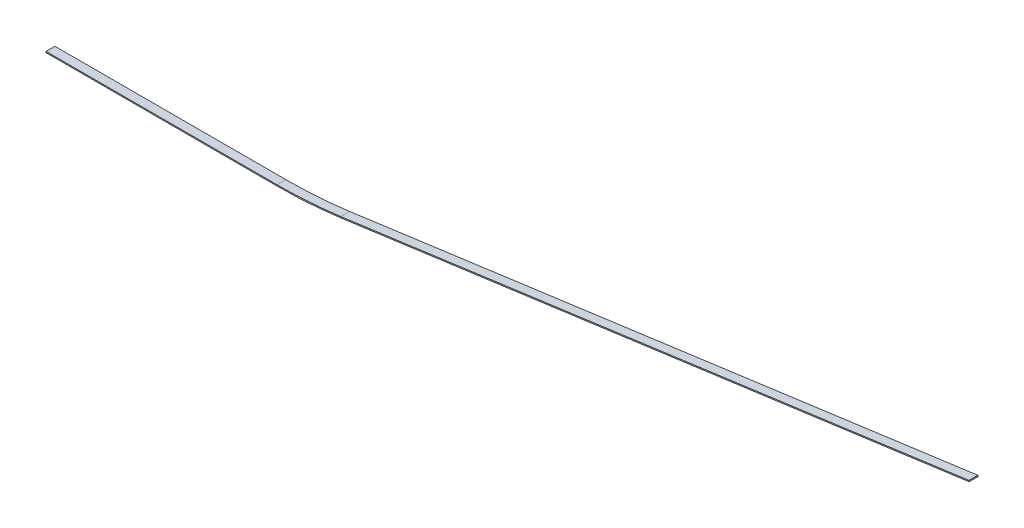
ISO-10303-21;
HEADER;
FILE_DESCRIPTION(('STEP AP214'),'2;1');
FILE_NAME('part.step','',(''),(''),'','','');
FILE_SCHEMA(('AUTOMOTIVE_DESIGN { 1 0 10303 214 1 1 1 1 }'));
ENDSEC;
DATA;
#1=APPLICATION_CONTEXT('core data for automotive mechanical design processes');
#2=APPLICATION_PROTOCOL_DEFINITION('international standard','automotive_design',2000,#1);
#3=PRODUCT_CONTEXT('',#1,'mechanical');
#4=PRODUCT('Part','Part','',(#3));
#5=PRODUCT_RELATED_PRODUCT_CATEGORY('part','',(#4));
#6=PRODUCT_DEFINITION_FORMATION('','',#4);
#7=PRODUCT_DEFINITION_CONTEXT('part definition',#1,'design');
#8=PRODUCT_DEFINITION('design','',#6,#7);
#9=PRODUCT_DEFINITION_SHAPE('','',#8);
#10=(LENGTH_UNIT() NAMED_UNIT(*) SI_UNIT(.MILLI.,.METRE.));
#11=(NAMED_UNIT(*) PLANE_ANGLE_UNIT() SI_UNIT($,.RADIAN.));
#12=(NAMED_UNIT(*) SI_UNIT($,.STERADIAN.) SOLID_ANGLE_UNIT());
#13=UNCERTAINTY_MEASURE_WITH_UNIT(LENGTH_MEASURE(1.E-05),#10,'distance_accuracy_value','');
#14=(GEOMETRIC_REPRESENTATION_CONTEXT(3) GLOBAL_UNCERTAINTY_ASSIGNED_CONTEXT((#13)) GLOBAL_UNIT_ASSIGNED_CONTEXT((#10,
#11,#12)) REPRESENTATION_CONTEXT('',''));
#15=CARTESIAN_POINT('',(0.,0.,0.));
#16=DIRECTION('',(0.,0.,1.));
#17=DIRECTION('',(1.,0.,0.));
#18=AXIS2_PLACEMENT_3D('',#15,#16,#17);
#19=CARTESIAN_POINT('',(5501.69221697348,3000.89216609369,9.525));
#20=DIRECTION('',(0.,1.,0.));
#21=DIRECTION('',(0.,0.,1.));
#22=AXIS2_PLACEMENT_3D('',#19,#20,#21);
#23=PLANE('',#22);
#24=DIRECTION('',(1.,0.,0.));
#25=VECTOR('',#24,1.);
#26=CARTESIAN_POINT('',(5501.69221697348,3000.89216609369,0.));
#27=LINE('',#26,#25);
#28=CARTESIAN_POINT('',(5501.69221697348,3000.89216609369,0.));
#29=VERTEX_POINT('',#28);
#30=CARTESIAN_POINT('',(5749.80284751638,3000.89216609369,0.));
#31=VERTEX_POINT('',#30);
#32=EDGE_CURVE('E131',#29,#31,#27,.T.);
#33=ORIENTED_EDGE('',*,*,#32,.T.);
#34=DIRECTION('',(0.,0.,-1.));
#35=VECTOR('',#34,1.);
#36=CARTESIAN_POINT('',(5749.80284751638,3000.89216609369,9.525));
#37=LINE('',#36,#35);
#38=CARTESIAN_POINT('',(5749.80284751638,3000.89216609369,9.525));
#39=VERTEX_POINT('',#38);
#40=EDGE_CURVE('E11',#39,#31,#37,.T.);
#41=ORIENTED_EDGE('',*,*,#40,.F.);
#42=DIRECTION('',(1.,0.,0.));
#43=VECTOR('',#42,1.);
#44=CARTESIAN_POINT('',(5501.69221697348,3000.89216609369,9.525));
#45=LINE('',#44,#43);
#46=CARTESIAN_POINT('',(5501.69221697348,3000.89216609369,9.525));
#47=VERTEX_POINT('',#46);
#48=EDGE_CURVE('E145',#47,#39,#45,.T.);
#49=ORIENTED_EDGE('',*,*,#48,.F.);
#50=DIRECTION('',(0.,0.,-1.));
#51=VECTOR('',#50,1.);
#52=CARTESIAN_POINT('',(5501.69221697348,3000.89216609369,9.525));
#53=LINE('',#52,#51);
#54=EDGE_CURVE('E127',#47,#29,#53,.T.);
#55=ORIENTED_EDGE('',*,*,#54,.T.);
#56=EDGE_LOOP('',(#33,#41,#49,#55));
#57=FACE_BOUND('',#56,.T.);
#58=ADVANCED_FACE('F35',(#57),#23,.F.);
#59=CARTESIAN_POINT('',(5749.80284751639,3508.89216609369,9.525));
#60=DIRECTION('',(0.,0.,-1.));
#61=DIRECTION('',(-1.,0.,0.));
#62=AXIS2_PLACEMENT_3D('',#59,#60,#61);
#63=CYLINDRICAL_SURFACE('',#62,508.);
#64=CARTESIAN_POINT('',(5749.80284751639,3508.89216609369,0.));
#65=DIRECTION('',(0.,0.,1.));
#66=DIRECTION('',(1.,0.,0.));
#67=AXIS2_PLACEMENT_3D('',#64,#65,#66);
#68=CIRCLE('',#67,508.);
#69=CARTESIAN_POINT('',(5818.41578125789,3005.54709030236,0.));
#70=VERTEX_POINT('',#69);
#71=EDGE_CURVE('E134',#31,#70,#68,.T.);
#72=ORIENTED_EDGE('',*,*,#71,.T.);
#73=DIRECTION('',(0.,0.,-1.));
#74=VECTOR('',#73,1.);
#75=CARTESIAN_POINT('',(5818.41578125789,3005.54709030236,9.525));
#76=LINE('',#75,#74);
#77=CARTESIAN_POINT('',(5818.41578125789,3005.54709030236,9.525));
#78=VERTEX_POINT('',#77);
#79=EDGE_CURVE('E43',#78,#70,#76,.T.);
#80=ORIENTED_EDGE('',*,*,#79,.F.);
#81=CARTESIAN_POINT('',(5749.80284751639,3508.89216609369,9.525));
#82=DIRECTION('',(0.,0.,1.));
#83=DIRECTION('',(1.,0.,0.));
#84=AXIS2_PLACEMENT_3D('',#81,#82,#83);
#85=CIRCLE('',#84,508.);
#86=EDGE_CURVE('E94',#39,#78,#85,.T.);
#87=ORIENTED_EDGE('',*,*,#86,.F.);
#88=ORIENTED_EDGE('',*,*,#40,.T.);
#89=EDGE_LOOP('',(#72,#80,#87,#88));
#90=FACE_BOUND('',#89,.T.);
#91=ADVANCED_FACE('F180',(#90),#63,.T.);
#92=CARTESIAN_POINT('',(5818.41578125789,3005.54709030236,9.525));
#93=DIRECTION('',(-0.135064830199822,0.990836763368767,0.));
#94=DIRECTION('',(-0.990836763368767,-0.135064830199822,0.));
#95=AXIS2_PLACEMENT_3D('',#92,#93,#94);
#96=PLANE('',#95);
#97=DIRECTION('',(0.990836763368767,0.135064830199822,0.));
#98=VECTOR('',#97,1.);
#99=CARTESIAN_POINT('',(5818.41578125789,3005.54709030236,0.));
#100=LINE('',#99,#98);
#101=CARTESIAN_POINT('',(6493.31572066677,3097.54533773134,0.));
#102=VERTEX_POINT('',#101);
#103=EDGE_CURVE('E136',#70,#102,#100,.T.);
#104=ORIENTED_EDGE('',*,*,#103,.T.);
#105=DIRECTION('',(0.,0.,-1.));
#106=VECTOR('',#105,1.);
#107=CARTESIAN_POINT('',(6493.31572066677,3097.54533773134,9.525));
#108=LINE('',#107,#106);
#109=CARTESIAN_POINT('',(6493.31572066677,3097.54533773134,9.525));
#110=VERTEX_POINT('',#109);
#111=EDGE_CURVE('E152',#110,#102,#108,.T.);
#112=ORIENTED_EDGE('',*,*,#111,.F.);
#113=DIRECTION('',(0.990836763368767,0.135064830199822,0.));
#114=VECTOR('',#113,1.);
#115=CARTESIAN_POINT('',(5818.41578125789,3005.54709030236,9.525));
#116=LINE('',#115,#114);
#117=EDGE_CURVE('E160',#78,#110,#116,.T.);
#118=ORIENTED_EDGE('',*,*,#117,.F.);
#119=ORIENTED_EDGE('',*,*,#79,.T.);
#120=EDGE_LOOP('',(#104,#112,#118,#119));
#121=FACE_BOUND('',#120,.T.);
#122=ADVANCED_FACE('F158',(#121),#96,.F.);
#123=CARTESIAN_POINT('',(6493.31572066677,3097.54533773134,9.525));
#124=DIRECTION('',(-0.990268068741507,-0.139173100960516,0.));
#125=DIRECTION('',(0.139173100960516,-0.990268068741507,0.));
#126=AXIS2_PLACEMENT_3D('',#123,#124,#125);
#127=PLANE('',#126);
#128=DIRECTION('',(-0.139173100960516,0.990268068741507,0.));
#129=VECTOR('',#128,1.);
#130=CARTESIAN_POINT('',(6493.31572066677,3097.54533773134,0.));
#131=LINE('',#130,#129);
#132=CARTESIAN_POINT('',(6493.14603936271,3098.75268294471,0.));
#133=VERTEX_POINT('',#132);
#134=EDGE_CURVE('E138',#102,#133,#131,.T.);
#135=ORIENTED_EDGE('',*,*,#134,.T.);
#136=DIRECTION('',(0.,0.,-1.));
#137=VECTOR('',#136,1.);
#138=CARTESIAN_POINT('',(6493.14603936271,3098.75268294471,9.525));
#139=LINE('',#138,#137);
#140=CARTESIAN_POINT('',(6493.14603936271,3098.75268294471,9.525));
#141=VERTEX_POINT('',#140);
#142=EDGE_CURVE('E149',#141,#133,#139,.T.);
#143=ORIENTED_EDGE('',*,*,#142,.F.);
#144=DIRECTION('',(-0.139173100960516,0.990268068741507,0.));
#145=VECTOR('',#144,1.);
#146=CARTESIAN_POINT('',(6493.31572066677,3097.54533773134,9.525));
#147=LINE('',#146,#145);
#148=EDGE_CURVE('E172',#110,#141,#147,.T.);
#149=ORIENTED_EDGE('',*,*,#148,.F.);
#150=ORIENTED_EDGE('',*,*,#111,.T.);
#151=EDGE_LOOP('',(#135,#143,#149,#150));
#152=FACE_BOUND('',#151,.T.);
#153=ADVANCED_FACE('F168',(#152),#127,.F.);
#154=CARTESIAN_POINT('',(5818.25111021691,3006.75511848426,9.525));
#155=DIRECTION('',(0.135064830199822,-0.990836763368766,0.));
#156=DIRECTION('',(0.990836763368767,0.135064830199822,0.));
#157=AXIS2_PLACEMENT_3D('',#154,#155,#156);
#158=PLANE('',#157);
#159=DIRECTION('',(-0.990836763368767,-0.135064830199822,0.));
#160=VECTOR('',#159,1.);
#161=CARTESIAN_POINT('',(5818.25111021691,3006.75511848426,0.));
#162=LINE('',#161,#160);
#163=CARTESIAN_POINT('',(5818.25111021691,3006.75511848426,0.));
#164=VERTEX_POINT('',#163);
#165=EDGE_CURVE('E140',#133,#164,#162,.T.);
#166=ORIENTED_EDGE('',*,*,#165,.T.);
#167=DIRECTION('',(0.,0.,-1.));
#168=VECTOR('',#167,1.);
#169=CARTESIAN_POINT('',(5818.25111021691,3006.75511848426,9.525));
#170=LINE('',#169,#168);
#171=CARTESIAN_POINT('',(5818.25111021691,3006.75511848426,9.525));
#172=VERTEX_POINT('',#171);
#173=EDGE_CURVE('E122',#172,#164,#170,.T.);
#174=ORIENTED_EDGE('',*,*,#173,.F.);
#175=DIRECTION('',(-0.990836763368767,-0.135064830199822,0.));
#176=VECTOR('',#175,1.);
#177=CARTESIAN_POINT('',(5818.25111021691,3006.75511848426,9.525));
#178=LINE('',#177,#176);
#179=EDGE_CURVE('E113',#141,#172,#178,.T.);
#180=ORIENTED_EDGE('',*,*,#179,.F.);
#181=ORIENTED_EDGE('',*,*,#142,.T.);
#182=EDGE_LOOP('',(#166,#174,#180,#181));
#183=FACE_BOUND('',#182,.T.);
#184=ADVANCED_FACE('F171',(#183),#158,.F.);
#185=CARTESIAN_POINT('',(5749.80284751639,3508.89216609369,9.525));
#186=DIRECTION('',(0.,0.,-1.));
#187=DIRECTION('',(-1.,0.,0.));
#188=AXIS2_PLACEMENT_3D('',#185,#186,#187);
#189=CYLINDRICAL_SURFACE('',#188,506.780799999999);
#190=CARTESIAN_POINT('',(5749.80284751639,3508.89216609369,0.));
#191=DIRECTION('',(0.,0.,-1.));
#192=DIRECTION('',(1.,0.,0.));
#193=AXIS2_PLACEMENT_3D('',#190,#191,#192);
#194=CIRCLE('',#193,506.780799999999);
#195=CARTESIAN_POINT('',(5749.80284751638,3002.11136609369,0.));
#196=VERTEX_POINT('',#195);
#197=EDGE_CURVE('E121',#164,#196,#194,.T.);
#198=ORIENTED_EDGE('',*,*,#197,.T.);
#199=DIRECTION('',(0.,0.,-1.));
#200=VECTOR('',#199,1.);
#201=CARTESIAN_POINT('',(5749.80284751638,3002.11136609369,9.525));
#202=LINE('',#201,#200);
#203=CARTESIAN_POINT('',(5749.80284751638,3002.11136609369,9.525));
#204=VERTEX_POINT('',#203);
#205=EDGE_CURVE('E118',#204,#196,#202,.T.);
#206=ORIENTED_EDGE('',*,*,#205,.F.);
#207=CARTESIAN_POINT('',(5749.80284751639,3508.89216609369,9.525));
#208=DIRECTION('',(0.,0.,-1.));
#209=DIRECTION('',(1.,0.,0.));
#210=AXIS2_PLACEMENT_3D('',#207,#208,#209);
#211=CIRCLE('',#210,506.780799999999);
#212=EDGE_CURVE('E107',#172,#204,#211,.T.);
#213=ORIENTED_EDGE('',*,*,#212,.F.);
#214=ORIENTED_EDGE('',*,*,#173,.T.);
#215=EDGE_LOOP('',(#198,#206,#213,#214));
#216=FACE_BOUND('',#215,.T.);
#217=ADVANCED_FACE('F119',(#216),#189,.F.);
#218=CARTESIAN_POINT('',(5501.69221697348,3002.11136609369,9.525));
#219=DIRECTION('',(0.,-1.,0.));
#220=DIRECTION('',(1.,0.,0.));
#221=AXIS2_PLACEMENT_3D('',#218,#219,#220);
#222=PLANE('',#221);
#223=DIRECTION('',(-1.,0.,0.));
#224=VECTOR('',#223,1.);
#225=CARTESIAN_POINT('',(5501.69221697348,3002.11136609369,0.));
#226=LINE('',#225,#224);
#227=CARTESIAN_POINT('',(5501.69221697348,3002.11136609369,0.));
#228=VERTEX_POINT('',#227);
#229=EDGE_CURVE('E80',#196,#228,#226,.T.);
#230=ORIENTED_EDGE('',*,*,#229,.T.);
#231=DIRECTION('',(0.,0.,-1.));
#232=VECTOR('',#231,1.);
#233=CARTESIAN_POINT('',(5501.69221697348,3002.11136609369,9.525));
#234=LINE('',#233,#232);
#235=CARTESIAN_POINT('',(5501.69221697348,3002.11136609369,9.525));
#236=VERTEX_POINT('',#235);
#237=EDGE_CURVE('E123',#236,#228,#234,.T.);
#238=ORIENTED_EDGE('',*,*,#237,.F.);
#239=DIRECTION('',(-1.,0.,0.));
#240=VECTOR('',#239,1.);
#241=CARTESIAN_POINT('',(5501.69221697348,3002.11136609369,9.525));
#242=LINE('',#241,#240);
#243=EDGE_CURVE('E111',#204,#236,#242,.T.);
#244=ORIENTED_EDGE('',*,*,#243,.F.);
#245=ORIENTED_EDGE('',*,*,#205,.T.);
#246=EDGE_LOOP('',(#230,#238,#244,#245));
#247=FACE_BOUND('',#246,.T.);
#248=ADVANCED_FACE('F125',(#247),#222,.F.);
#249=CARTESIAN_POINT('',(5501.69221697348,3000.89216609369,9.525));
#250=DIRECTION('',(1.,0.,0.));
#251=DIRECTION('',(0.,0.,-1.));
#252=AXIS2_PLACEMENT_3D('',#249,#250,#251);
#253=PLANE('',#252);
#254=DIRECTION('',(0.,-1.,0.));
#255=VECTOR('',#254,1.);
#256=CARTESIAN_POINT('',(5501.69221697348,3000.89216609369,0.));
#257=LINE('',#256,#255);
#258=EDGE_CURVE('E86',#228,#29,#257,.T.);
#259=ORIENTED_EDGE('',*,*,#258,.T.);
#260=ORIENTED_EDGE('',*,*,#54,.F.);
#261=DIRECTION('',(0.,-1.,0.));
#262=VECTOR('',#261,1.);
#263=CARTESIAN_POINT('',(5501.69221697348,3000.89216609369,9.525));
#264=LINE('',#263,#262);
#265=EDGE_CURVE('E51',#236,#47,#264,.T.);
#266=ORIENTED_EDGE('',*,*,#265,.F.);
#267=ORIENTED_EDGE('',*,*,#237,.T.);
#268=EDGE_LOOP('',(#259,#260,#266,#267));
#269=FACE_BOUND('',#268,.T.);
#270=ADVANCED_FACE('F196',(#269),#253,.F.);
#271=CARTESIAN_POINT('',(5749.80284751639,3508.89216609369,9.525));
#272=DIRECTION('',(0.,0.,1.));
#273=DIRECTION('',(1.,0.,0.));
#274=AXIS2_PLACEMENT_3D('',#271,#272,#273);
#275=PLANE('',#274);
#276=ORIENTED_EDGE('',*,*,#48,.T.);
#277=ORIENTED_EDGE('',*,*,#86,.T.);
#278=ORIENTED_EDGE('',*,*,#117,.T.);
#279=ORIENTED_EDGE('',*,*,#148,.T.);
#280=ORIENTED_EDGE('',*,*,#179,.T.);
#281=ORIENTED_EDGE('',*,*,#212,.T.);
#282=ORIENTED_EDGE('',*,*,#243,.T.);
#283=ORIENTED_EDGE('',*,*,#265,.T.);
#284=EDGE_LOOP('',(#276,#277,#278,#279,#280,#281,#282,#283));
#285=FACE_BOUND('',#284,.T.);
#286=ADVANCED_FACE('F109',(#285),#275,.T.);
#287=CARTESIAN_POINT('',(5749.80284751639,3508.89216609369,0.));
#288=DIRECTION('',(0.,0.,1.));
#289=DIRECTION('',(1.,0.,0.));
#290=AXIS2_PLACEMENT_3D('',#287,#288,#289);
#291=PLANE('',#290);
#292=ORIENTED_EDGE('',*,*,#32,.F.);
#293=ORIENTED_EDGE('',*,*,#258,.F.);
#294=ORIENTED_EDGE('',*,*,#229,.F.);
#295=ORIENTED_EDGE('',*,*,#197,.F.);
#296=ORIENTED_EDGE('',*,*,#165,.F.);
#297=ORIENTED_EDGE('',*,*,#134,.F.);
#298=ORIENTED_EDGE('',*,*,#103,.F.);
#299=ORIENTED_EDGE('',*,*,#71,.F.);
#300=EDGE_LOOP('',(#292,#293,#294,#295,#296,#297,#298,#299));
#301=FACE_BOUND('',#300,.T.);
#302=ADVANCED_FACE('F164',(#301),#291,.F.);
#303=CLOSED_SHELL('',(#58,#91,#122,#153,#184,#217,#248,#270,#286,#302));
#304=MANIFOLD_SOLID_BREP('B2',#303);
#305=ADVANCED_BREP_SHAPE_REPRESENTATION('',(#18,#304),#14);
#306=SHAPE_DEFINITION_REPRESENTATION(#9,#305);
ENDSEC;
END-ISO-10303-21;
